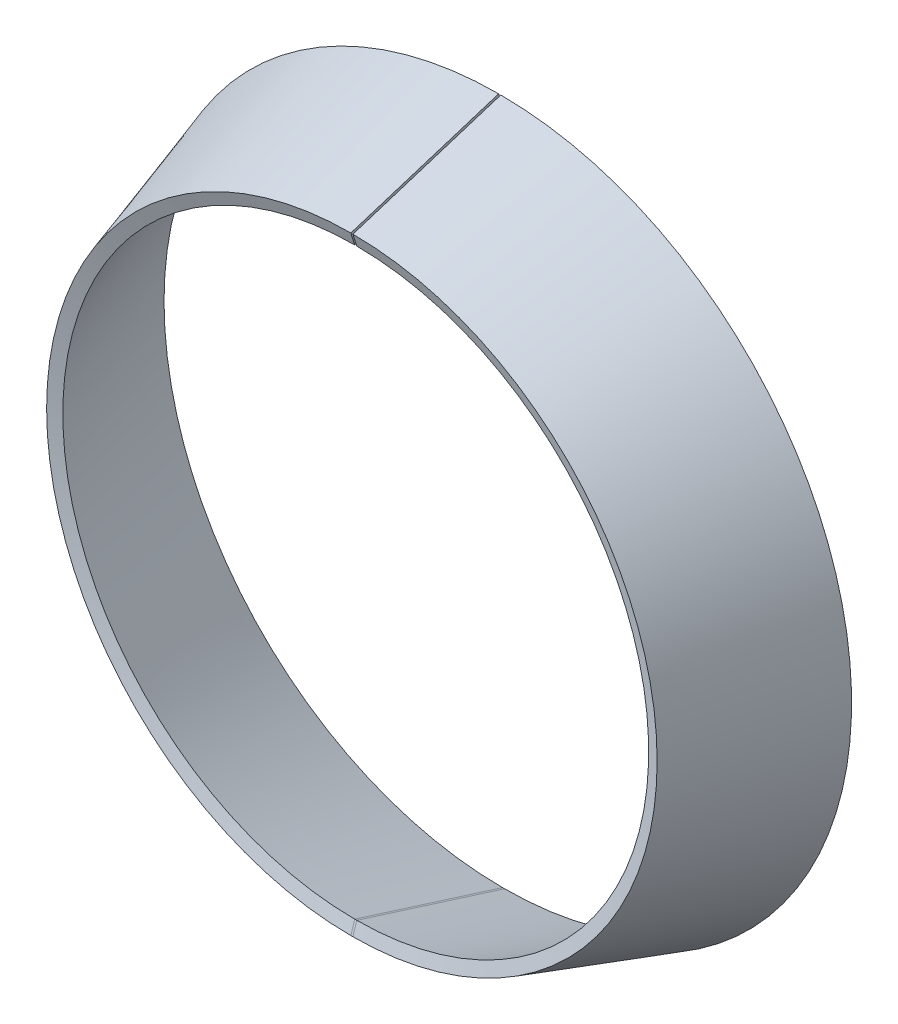
ISO-10303-21;
HEADER;
FILE_DESCRIPTION(('STEP AP214'),'2;1');
FILE_NAME('part.step','',(''),(''),'','','');
FILE_SCHEMA(('AUTOMOTIVE_DESIGN { 1 0 10303 214 1 1 1 1 }'));
ENDSEC;
DATA;
#1=APPLICATION_CONTEXT('core data for automotive mechanical design processes');
#2=APPLICATION_PROTOCOL_DEFINITION('international standard','automotive_design',2000,#1);
#3=PRODUCT_CONTEXT('',#1,'mechanical');
#4=PRODUCT('Part','Part','',(#3));
#5=PRODUCT_RELATED_PRODUCT_CATEGORY('part','',(#4));
#6=PRODUCT_DEFINITION_FORMATION('','',#4);
#7=PRODUCT_DEFINITION_CONTEXT('part definition',#1,'design');
#8=PRODUCT_DEFINITION('design','',#6,#7);
#9=PRODUCT_DEFINITION_SHAPE('','',#8);
#10=(LENGTH_UNIT() NAMED_UNIT(*) SI_UNIT(.MILLI.,.METRE.));
#11=(NAMED_UNIT(*) PLANE_ANGLE_UNIT() SI_UNIT($,.RADIAN.));
#12=(NAMED_UNIT(*) SI_UNIT($,.STERADIAN.) SOLID_ANGLE_UNIT());
#13=UNCERTAINTY_MEASURE_WITH_UNIT(LENGTH_MEASURE(1.E-05),#10,'distance_accuracy_value','');
#14=(GEOMETRIC_REPRESENTATION_CONTEXT(3) GLOBAL_UNCERTAINTY_ASSIGNED_CONTEXT((#13)) GLOBAL_UNIT_ASSIGNED_CONTEXT((#10,
#11,#12)) REPRESENTATION_CONTEXT('',''));
#15=CARTESIAN_POINT('',(0.,0.,0.));
#16=DIRECTION('',(0.,0.,1.));
#17=DIRECTION('',(1.,0.,0.));
#18=AXIS2_PLACEMENT_3D('',#15,#16,#17);
#19=CARTESIAN_POINT('',(0.254,-74.7830513186256,-49.4192184453104));
#20=DIRECTION('',(0.,0.953716950748231,-0.30070579950426));
#21=DIRECTION('',(0.,0.30070579950426,0.953716950748231));
#22=AXIS2_PLACEMENT_3D('',#19,#20,#21);
#23=PLANE('',#22);
#24=DIRECTION('',(0.,-0.30070579950426,-0.953716950748231));
#25=VECTOR('',#24,1.);
#26=CARTESIAN_POINT('',(-0.254,-74.7830513186256,-49.4192184453104));
#27=LINE('',#26,#25);
#28=CARTESIAN_POINT('',(-0.253999999999986,-74.7830513186257,-49.4192184453104));
#29=VERTEX_POINT('',#28);
#30=CARTESIAN_POINT('',(-0.254,-86.2399422797379,-85.755834268818));
#31=VERTEX_POINT('',#30);
#32=EDGE_CURVE('E160',#29,#31,#27,.T.);
#33=ORIENTED_EDGE('',*,*,#32,.T.);
#34=DIRECTION('',(-1.,0.,0.));
#35=VECTOR('',#34,1.);
#36=CARTESIAN_POINT('',(0.254,-86.2399422797379,-85.755834268818));
#37=LINE('',#36,#35);
#38=CARTESIAN_POINT('',(0.253999999999984,-86.239942279738,-85.755834268818));
#39=VERTEX_POINT('',#38);
#40=EDGE_CURVE('E163',#39,#31,#37,.T.);
#41=ORIENTED_EDGE('',*,*,#40,.F.);
#42=DIRECTION('',(0.,-0.30070579950426,-0.953716950748231));
#43=VECTOR('',#42,1.);
#44=CARTESIAN_POINT('',(0.254,-74.7830513186256,-49.4192184453104));
#45=LINE('',#44,#43);
#46=CARTESIAN_POINT('',(0.254,-74.7830513186256,-49.4192184453104));
#47=VERTEX_POINT('',#46);
#48=EDGE_CURVE('E62',#47,#39,#45,.T.);
#49=ORIENTED_EDGE('',*,*,#48,.F.);
#50=DIRECTION('',(-1.,0.,0.));
#51=VECTOR('',#50,1.);
#52=CARTESIAN_POINT('',(0.254,-74.7830513186256,-49.4192184453104));
#53=LINE('',#52,#51);
#54=EDGE_CURVE('E166',#47,#29,#53,.T.);
#55=ORIENTED_EDGE('',*,*,#54,.T.);
#56=EDGE_LOOP('',(#33,#41,#49,#55));
#57=FACE_BOUND('',#56,.T.);
#58=ADVANCED_FACE('F38',(#57),#23,.F.);
#59=CARTESIAN_POINT('',(0.254,0.924691202749656,-73.2897779710608));
#60=DIRECTION('',(0.,0.30070579950426,0.953716950748231));
#61=DIRECTION('',(0.,-0.953716950748231,0.30070579950426));
#62=AXIS2_PLACEMENT_3D('',#59,#60,#61);
#63=PLANE('',#62);
#64=ORIENTED_EDGE('',*,*,#54,.F.);
#65=DIRECTION('',(0.,-0.953716950748231,0.30070579950426));
#66=VECTOR('',#65,1.);
#67=CARTESIAN_POINT('',(0.254,0.924691202749656,-73.2897779710608));
#68=LINE('',#67,#66);
#69=CARTESIAN_POINT('',(0.254,-71.755,-50.3739593587364));
#70=VERTEX_POINT('',#69);
#71=EDGE_CURVE('E46',#70,#47,#68,.T.);
#72=ORIENTED_EDGE('',*,*,#71,.F.);
#73=DIRECTION('',(-1.,0.,0.));
#74=VECTOR('',#73,1.);
#75=CARTESIAN_POINT('',(0.254,-71.755,-50.3739593587364));
#76=LINE('',#75,#74);
#77=CARTESIAN_POINT('',(-0.253999999999987,-71.755,-50.3739593587364));
#78=VERTEX_POINT('',#77);
#79=EDGE_CURVE('E171',#70,#78,#76,.T.);
#80=ORIENTED_EDGE('',*,*,#79,.T.);
#81=DIRECTION('',(0.,-0.953716950748231,0.30070579950426));
#82=VECTOR('',#81,1.);
#83=CARTESIAN_POINT('',(-0.254,0.924691202749656,-73.2897779710608));
#84=LINE('',#83,#82);
#85=EDGE_CURVE('E11',#78,#29,#84,.T.);
#86=ORIENTED_EDGE('',*,*,#85,.T.);
#87=EDGE_LOOP('',(#64,#72,#80,#86));
#88=FACE_BOUND('',#87,.T.);
#89=ADVANCED_FACE('F40',(#88),#63,.T.);
#90=CARTESIAN_POINT('',(0.254,-10.5321997583626,-109.626393794568));
#91=DIRECTION('',(0.,0.30070579950426,0.953716950748231));
#92=DIRECTION('',(0.,-0.953716950748231,0.30070579950426));
#93=AXIS2_PLACEMENT_3D('',#90,#91,#92);
#94=PLANE('',#93);
#95=DIRECTION('',(0.,-0.953716950748231,0.30070579950426));
#96=VECTOR('',#95,1.);
#97=CARTESIAN_POINT('',(0.254,-10.5321997583626,-109.626393794568));
#98=LINE('',#97,#96);
#99=CARTESIAN_POINT('',(0.254,-83.2118909611123,-86.710575182244));
#100=VERTEX_POINT('',#99);
#101=EDGE_CURVE('E178',#100,#39,#98,.T.);
#102=ORIENTED_EDGE('',*,*,#101,.T.);
#103=ORIENTED_EDGE('',*,*,#40,.T.);
#104=DIRECTION('',(0.,-0.953716950748231,0.30070579950426));
#105=VECTOR('',#104,1.);
#106=CARTESIAN_POINT('',(-0.254,-10.5321997583626,-109.626393794568));
#107=LINE('',#106,#105);
#108=CARTESIAN_POINT('',(-0.254000000000015,-83.2118909611123,-86.7105751822441));
#109=VERTEX_POINT('',#108);
#110=EDGE_CURVE('E126',#109,#31,#107,.T.);
#111=ORIENTED_EDGE('',*,*,#110,.F.);
#112=DIRECTION('',(-1.,0.,0.));
#113=VECTOR('',#112,1.);
#114=CARTESIAN_POINT('',(0.254,-83.2118909611123,-86.710575182244));
#115=LINE('',#114,#113);
#116=EDGE_CURVE('E53',#100,#109,#115,.T.);
#117=ORIENTED_EDGE('',*,*,#116,.F.);
#118=EDGE_LOOP('',(#102,#103,#111,#117));
#119=FACE_BOUND('',#118,.T.);
#120=ADVANCED_FACE('F203',(#119),#94,.F.);
#121=CARTESIAN_POINT('',(0.254,-71.755,-50.3739593587364));
#122=DIRECTION('',(0.,0.953716950748231,-0.30070579950426));
#123=DIRECTION('',(0.,0.30070579950426,0.953716950748231));
#124=AXIS2_PLACEMENT_3D('',#121,#122,#123);
#125=PLANE('',#124);
#126=DIRECTION('',(0.,-0.30070579950426,-0.953716950748231));
#127=VECTOR('',#126,1.);
#128=CARTESIAN_POINT('',(-0.254,-71.755,-50.3739593587364));
#129=LINE('',#128,#127);
#130=EDGE_CURVE('E168',#78,#109,#129,.T.);
#131=ORIENTED_EDGE('',*,*,#130,.F.);
#132=ORIENTED_EDGE('',*,*,#79,.F.);
#133=DIRECTION('',(0.,-0.30070579950426,-0.953716950748231));
#134=VECTOR('',#133,1.);
#135=CARTESIAN_POINT('',(0.254,-71.755,-50.3739593587364));
#136=LINE('',#135,#134);
#137=EDGE_CURVE('E174',#70,#100,#136,.T.);
#138=ORIENTED_EDGE('',*,*,#137,.T.);
#139=ORIENTED_EDGE('',*,*,#116,.T.);
#140=EDGE_LOOP('',(#131,#132,#138,#139));
#141=FACE_BOUND('',#140,.T.);
#142=ADVANCED_FACE('F200',(#141),#125,.T.);
#143=CARTESIAN_POINT('',(0.253999999997812,84.5442335413074,-86.2904891803364));
#144=DIRECTION('',(-1.,0.,0.));
#145=DIRECTION('',(0.,-0.30070579950426,0.953716950748231));
#146=AXIS2_PLACEMENT_3D('',#143,#144,#145);
#147=PLANE('',#146);
#148=DIRECTION('',(0.,-0.953716950748231,-0.30070579950426));
#149=VECTOR('',#148,1.);
#150=CARTESIAN_POINT('',(0.253999999998178,73.0873425801952,-49.953873356829));
#151=LINE('',#150,#149);
#152=CARTESIAN_POINT('',(0.253999999998136,74.7830513186256,-49.4192184453104));
#153=VERTEX_POINT('',#152);
#154=CARTESIAN_POINT('',(0.253999999998211,71.7549999999999,-50.3739593587364));
#155=VERTEX_POINT('',#154);
#156=EDGE_CURVE('E158',#153,#155,#151,.T.);
#157=ORIENTED_EDGE('',*,*,#156,.F.);
#158=DIRECTION('',(0.,0.30070579950426,-0.953716950748231));
#159=VECTOR('',#158,1.);
#160=CARTESIAN_POINT('',(0.253999999979266,817.113368081691,-2403.79019272779));
#161=LINE('',#160,#159);
#162=CARTESIAN_POINT('',(0.253999999997768,86.239942279738,-85.7558342688178));
#163=VERTEX_POINT('',#162);
#164=EDGE_CURVE('E152',#163,#153,#161,.F.);
#165=ORIENTED_EDGE('',*,*,#164,.F.);
#166=DIRECTION('',(0.,-0.953716950748231,-0.30070579950426));
#167=VECTOR('',#166,1.);
#168=CARTESIAN_POINT('',(0.253999999997812,84.5442335413074,-86.2904891803364));
#169=LINE('',#168,#167);
#170=CARTESIAN_POINT('',(0.253999999997846,83.2118909611123,-86.7105751822439));
#171=VERTEX_POINT('',#170);
#172=EDGE_CURVE('E142',#163,#171,#169,.T.);
#173=ORIENTED_EDGE('',*,*,#172,.T.);
#174=DIRECTION('',(0.,0.30070579950426,-0.953716950748231));
#175=VECTOR('',#174,1.);
#176=CARTESIAN_POINT('',(0.253999999979343,814.085316763065,-2404.74493364122));
#177=LINE('',#176,#175);
#178=EDGE_CURVE('E143',#171,#155,#177,.F.);
#179=ORIENTED_EDGE('',*,*,#178,.T.);
#180=EDGE_LOOP('',(#157,#165,#173,#179));
#181=FACE_BOUND('',#180,.T.);
#182=ADVANCED_FACE('F192',(#181),#147,.T.);
#183=CARTESIAN_POINT('',(0.254,0.,-86.2904891803367));
#184=DIRECTION('',(0.,0.,1.));
#185=DIRECTION('',(1.,0.,0.));
#186=AXIS2_PLACEMENT_3D('',#183,#184,#185);
#187=CONICAL_SURFACE('',#186,84.5442335413075,1.2653637076959);
#188=ORIENTED_EDGE('',*,*,#172,.F.);
#189=CARTESIAN_POINT('',(0.254,0.,-85.7558342688183));
#190=DIRECTION('',(0.,0.,-1.));
#191=DIRECTION('',(-1.,0.,0.));
#192=AXIS2_PLACEMENT_3D('',#189,#190,#191);
#193=CIRCLE('',#192,86.2399422797381);
#194=EDGE_CURVE('E149',#39,#163,#193,.F.);
#195=ORIENTED_EDGE('',*,*,#194,.F.);
#196=ORIENTED_EDGE('',*,*,#101,.F.);
#197=CARTESIAN_POINT('',(0.254,0.,-86.7105751822441));
#198=DIRECTION('',(0.,0.,-1.));
#199=DIRECTION('',(-1.,0.,0.));
#200=AXIS2_PLACEMENT_3D('',#197,#198,#199);
#201=CIRCLE('',#200,83.2118909611124);
#202=EDGE_CURVE('E139',#100,#171,#201,.F.);
#203=ORIENTED_EDGE('',*,*,#202,.T.);
#204=EDGE_LOOP('',(#188,#195,#196,#203));
#205=FACE_BOUND('',#204,.T.);
#206=ADVANCED_FACE('F202',(#205),#187,.T.);
#207=CARTESIAN_POINT('',(0.254,0.,-49.953873356829));
#208=DIRECTION('',(0.,0.,1.));
#209=DIRECTION('',(1.,0.,0.));
#210=AXIS2_PLACEMENT_3D('',#207,#208,#209);
#211=CONICAL_SURFACE('',#210,73.0873425801952,1.2653637076959);
#212=CARTESIAN_POINT('',(0.254,0.,-49.4192184453106));
#213=DIRECTION('',(0.,0.,-1.));
#214=DIRECTION('',(-1.,0.,0.));
#215=AXIS2_PLACEMENT_3D('',#212,#213,#214);
#216=CIRCLE('',#215,74.7830513186257);
#217=EDGE_CURVE('E138',#153,#47,#216,.T.);
#218=ORIENTED_EDGE('',*,*,#217,.F.);
#219=ORIENTED_EDGE('',*,*,#156,.T.);
#220=CARTESIAN_POINT('',(0.254,0.,-50.3739593587365));
#221=DIRECTION('',(0.,0.,-1.));
#222=DIRECTION('',(-1.,0.,0.));
#223=AXIS2_PLACEMENT_3D('',#220,#221,#222);
#224=CIRCLE('',#223,71.755);
#225=EDGE_CURVE('E146',#155,#70,#224,.T.);
#226=ORIENTED_EDGE('',*,*,#225,.T.);
#227=ORIENTED_EDGE('',*,*,#71,.T.);
#228=EDGE_LOOP('',(#218,#219,#226,#227));
#229=FACE_BOUND('',#228,.T.);
#230=ADVANCED_FACE('F182',(#229),#211,.F.);
#231=CARTESIAN_POINT('',(0.254,0.,-2404.74493364122));
#232=DIRECTION('',(0.,0.,-1.));
#233=DIRECTION('',(-1.,0.,0.));
#234=AXIS2_PLACEMENT_3D('',#231,#232,#233);
#235=CONICAL_SURFACE('',#234,814.085316763065,0.305432619098994);
#236=ORIENTED_EDGE('',*,*,#137,.F.);
#237=ORIENTED_EDGE('',*,*,#225,.F.);
#238=ORIENTED_EDGE('',*,*,#178,.F.);
#239=ORIENTED_EDGE('',*,*,#202,.F.);
#240=EDGE_LOOP('',(#236,#237,#238,#239));
#241=FACE_BOUND('',#240,.T.);
#242=ADVANCED_FACE('F195',(#241),#235,.F.);
#243=CARTESIAN_POINT('',(0.254,0.,-2403.79019272779));
#244=DIRECTION('',(0.,0.,-1.));
#245=DIRECTION('',(-1.,0.,0.));
#246=AXIS2_PLACEMENT_3D('',#243,#244,#245);
#247=CONICAL_SURFACE('',#246,817.113368081691,0.305432619098994);
#248=ORIENTED_EDGE('',*,*,#48,.T.);
#249=ORIENTED_EDGE('',*,*,#194,.T.);
#250=ORIENTED_EDGE('',*,*,#164,.T.);
#251=ORIENTED_EDGE('',*,*,#217,.T.);
#252=EDGE_LOOP('',(#248,#249,#250,#251));
#253=FACE_BOUND('',#252,.T.);
#254=ADVANCED_FACE('F188',(#253),#247,.T.);
#255=CARTESIAN_POINT('',(-0.253999999998625,73.0873425801953,-49.9538733568289));
#256=DIRECTION('',(1.,0.,0.));
#257=DIRECTION('',(0.,0.300705799504261,-0.953716950748231));
#258=AXIS2_PLACEMENT_3D('',#255,#256,#257);
#259=PLANE('',#258);
#260=DIRECTION('',(0.,0.953716950748231,0.30070579950426));
#261=VECTOR('',#260,1.);
#262=CARTESIAN_POINT('',(-0.253999999998625,73.0873425801953,-49.9538733568289));
#263=LINE('',#262,#261);
#264=CARTESIAN_POINT('',(-0.25399999999865,71.755,-50.3739593587364));
#265=VERTEX_POINT('',#264);
#266=CARTESIAN_POINT('',(-0.253999999998593,74.7830513186257,-49.4192184453103));
#267=VERTEX_POINT('',#266);
#268=EDGE_CURVE('E115',#265,#267,#263,.T.);
#269=ORIENTED_EDGE('',*,*,#268,.F.);
#270=DIRECTION('',(0.,0.30070579950426,-0.953716950748231));
#271=VECTOR('',#270,1.);
#272=CARTESIAN_POINT('',(-0.2539999999836,814.085316763065,-2404.74493364122));
#273=LINE('',#272,#271);
#274=CARTESIAN_POINT('',(-0.253999999998221,83.2118909611123,-86.7105751822441));
#275=VERTEX_POINT('',#274);
#276=EDGE_CURVE('E111',#265,#275,#273,.T.);
#277=ORIENTED_EDGE('',*,*,#276,.T.);
#278=DIRECTION('',(0.,0.953716950748231,0.30070579950426));
#279=VECTOR('',#278,1.);
#280=CARTESIAN_POINT('',(-0.253999999998193,84.5442335413076,-86.2904891803367));
#281=LINE('',#280,#279);
#282=CARTESIAN_POINT('',(-0.253999999998156,86.239942279738,-85.7558342688181));
#283=VERTEX_POINT('',#282);
#284=EDGE_CURVE('E106',#275,#283,#281,.T.);
#285=ORIENTED_EDGE('',*,*,#284,.T.);
#286=DIRECTION('',(0.,0.30070579950426,-0.953716950748231));
#287=VECTOR('',#286,1.);
#288=CARTESIAN_POINT('',(-0.253999999983539,817.113368081691,-2403.7901927278));
#289=LINE('',#288,#287);
#290=EDGE_CURVE('E109',#267,#283,#289,.T.);
#291=ORIENTED_EDGE('',*,*,#290,.F.);
#292=EDGE_LOOP('',(#269,#277,#285,#291));
#293=FACE_BOUND('',#292,.T.);
#294=ADVANCED_FACE('F108',(#293),#259,.T.);
#295=CARTESIAN_POINT('',(-0.254,0.,-86.2904891803367));
#296=DIRECTION('',(0.,0.,1.));
#297=DIRECTION('',(1.,0.,0.));
#298=AXIS2_PLACEMENT_3D('',#295,#296,#297);
#299=CONICAL_SURFACE('',#298,84.5442335413076,1.2653637076959);
#300=ORIENTED_EDGE('',*,*,#284,.F.);
#301=CARTESIAN_POINT('',(-0.254,0.,-86.7105751822441));
#302=DIRECTION('',(0.,0.,-1.));
#303=DIRECTION('',(-1.,0.,0.));
#304=AXIS2_PLACEMENT_3D('',#301,#302,#303);
#305=CIRCLE('',#304,83.2118909611123);
#306=EDGE_CURVE('E134',#275,#109,#305,.F.);
#307=ORIENTED_EDGE('',*,*,#306,.T.);
#308=ORIENTED_EDGE('',*,*,#110,.T.);
#309=CARTESIAN_POINT('',(-0.254,0.,-85.7558342688183));
#310=DIRECTION('',(0.,0.,-1.));
#311=DIRECTION('',(-1.,0.,0.));
#312=AXIS2_PLACEMENT_3D('',#309,#310,#311);
#313=CIRCLE('',#312,86.239942279738);
#314=EDGE_CURVE('E122',#283,#31,#313,.F.);
#315=ORIENTED_EDGE('',*,*,#314,.F.);
#316=EDGE_LOOP('',(#300,#307,#308,#315));
#317=FACE_BOUND('',#316,.T.);
#318=ADVANCED_FACE('F125',(#317),#299,.T.);
#319=CARTESIAN_POINT('',(-0.254,0.,-49.953873356829));
#320=DIRECTION('',(0.,0.,1.));
#321=DIRECTION('',(1.,0.,0.));
#322=AXIS2_PLACEMENT_3D('',#319,#320,#321);
#323=CONICAL_SURFACE('',#322,73.0873425801953,1.2653637076959);
#324=CARTESIAN_POINT('',(-0.254,0.,-50.3739593587365));
#325=DIRECTION('',(0.,0.,-1.));
#326=DIRECTION('',(-1.,0.,0.));
#327=AXIS2_PLACEMENT_3D('',#324,#325,#326);
#328=CIRCLE('',#327,71.755);
#329=EDGE_CURVE('E128',#78,#265,#328,.T.);
#330=ORIENTED_EDGE('',*,*,#329,.T.);
#331=ORIENTED_EDGE('',*,*,#268,.T.);
#332=CARTESIAN_POINT('',(-0.254,0.,-49.4192184453106));
#333=DIRECTION('',(0.,0.,-1.));
#334=DIRECTION('',(-1.,0.,0.));
#335=AXIS2_PLACEMENT_3D('',#332,#333,#334);
#336=CIRCLE('',#335,74.7830513186257);
#337=EDGE_CURVE('E116',#29,#267,#336,.T.);
#338=ORIENTED_EDGE('',*,*,#337,.F.);
#339=ORIENTED_EDGE('',*,*,#85,.F.);
#340=EDGE_LOOP('',(#330,#331,#338,#339));
#341=FACE_BOUND('',#340,.T.);
#342=ADVANCED_FACE('F206',(#341),#323,.F.);
#343=CARTESIAN_POINT('',(-0.254,0.,-2403.7901927278));
#344=DIRECTION('',(0.,0.,-1.));
#345=DIRECTION('',(-1.,0.,0.));
#346=AXIS2_PLACEMENT_3D('',#343,#344,#345);
#347=CONICAL_SURFACE('',#346,817.113368081691,0.305432619098994);
#348=ORIENTED_EDGE('',*,*,#32,.F.);
#349=ORIENTED_EDGE('',*,*,#337,.T.);
#350=ORIENTED_EDGE('',*,*,#290,.T.);
#351=ORIENTED_EDGE('',*,*,#314,.T.);
#352=EDGE_LOOP('',(#348,#349,#350,#351));
#353=FACE_BOUND('',#352,.T.);
#354=ADVANCED_FACE('F121',(#353),#347,.T.);
#355=CARTESIAN_POINT('',(-0.254,0.,-2404.74493364122));
#356=DIRECTION('',(0.,0.,-1.));
#357=DIRECTION('',(-1.,0.,0.));
#358=AXIS2_PLACEMENT_3D('',#355,#356,#357);
#359=CONICAL_SURFACE('',#358,814.085316763065,0.305432619098994);
#360=ORIENTED_EDGE('',*,*,#130,.T.);
#361=ORIENTED_EDGE('',*,*,#306,.F.);
#362=ORIENTED_EDGE('',*,*,#276,.F.);
#363=ORIENTED_EDGE('',*,*,#329,.F.);
#364=EDGE_LOOP('',(#360,#361,#362,#363));
#365=FACE_BOUND('',#364,.T.);
#366=ADVANCED_FACE('F208',(#365),#359,.F.);
#367=CLOSED_SHELL('',(#58,#89,#120,#142,#182,#206,#230,#242,#254,#294,#318,#342,#354,#366));
#368=MANIFOLD_SOLID_BREP('B2',#367);
#369=ADVANCED_BREP_SHAPE_REPRESENTATION('',(#18,#368),#14);
#370=SHAPE_DEFINITION_REPRESENTATION(#9,#369);
ENDSEC;
END-ISO-10303-21;
